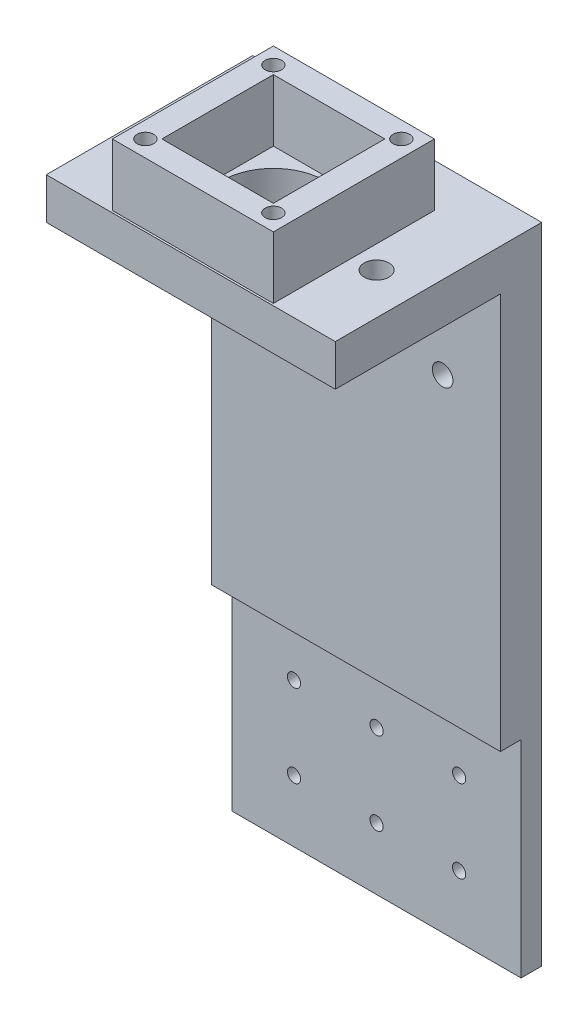
ISO-10303-21;
HEADER;
FILE_DESCRIPTION(('STEP AP214'),'2;1');
FILE_NAME('part.step','',(''),(''),'','','');
FILE_SCHEMA(('AUTOMOTIVE_DESIGN { 1 0 10303 214 1 1 1 1 }'));
ENDSEC;
DATA;
#1=APPLICATION_CONTEXT('core data for automotive mechanical design processes');
#2=APPLICATION_PROTOCOL_DEFINITION('international standard','automotive_design',2000,#1);
#3=PRODUCT_CONTEXT('',#1,'mechanical');
#4=PRODUCT('Part','Part','',(#3));
#5=PRODUCT_RELATED_PRODUCT_CATEGORY('part','',(#4));
#6=PRODUCT_DEFINITION_FORMATION('','',#4);
#7=PRODUCT_DEFINITION_CONTEXT('part definition',#1,'design');
#8=PRODUCT_DEFINITION('design','',#6,#7);
#9=PRODUCT_DEFINITION_SHAPE('','',#8);
#10=(LENGTH_UNIT() NAMED_UNIT(*) SI_UNIT(.MILLI.,.METRE.));
#11=(NAMED_UNIT(*) PLANE_ANGLE_UNIT() SI_UNIT($,.RADIAN.));
#12=(NAMED_UNIT(*) SI_UNIT($,.STERADIAN.) SOLID_ANGLE_UNIT());
#13=UNCERTAINTY_MEASURE_WITH_UNIT(LENGTH_MEASURE(1.E-05),#10,'distance_accuracy_value','');
#14=(GEOMETRIC_REPRESENTATION_CONTEXT(3) GLOBAL_UNCERTAINTY_ASSIGNED_CONTEXT((#13)) GLOBAL_UNIT_ASSIGNED_CONTEXT((#10,
#11,#12)) REPRESENTATION_CONTEXT('',''));
#15=CARTESIAN_POINT('',(0.,0.,0.));
#16=DIRECTION('',(0.,0.,1.));
#17=DIRECTION('',(1.,0.,0.));
#18=AXIS2_PLACEMENT_3D('',#15,#16,#17);
#19=CARTESIAN_POINT('',(37.8741031645975,90.,27.7151189199662));
#20=DIRECTION('',(0.,0.,1.));
#21=DIRECTION('',(1.,0.,0.));
#22=AXIS2_PLACEMENT_3D('',#19,#20,#21);
#23=PLANE('',#22);
#24=DIRECTION('',(-1.,0.,0.));
#25=VECTOR('',#24,1.);
#26=CARTESIAN_POINT('',(37.8741031645975,90.,27.7151189199662));
#27=LINE('',#26,#25);
#28=CARTESIAN_POINT('',(37.8641031645975,90.,27.7151189199662));
#29=VERTEX_POINT('',#28);
#30=CARTESIAN_POINT('',(-32.1358968354025,90.,27.7151189199662));
#31=VERTEX_POINT('',#30);
#32=EDGE_CURVE('E48',#29,#31,#27,.T.);
#33=ORIENTED_EDGE('',*,*,#32,.F.);
#34=DIRECTION('',(0.,1.,0.));
#35=VECTOR('',#34,1.);
#36=CARTESIAN_POINT('',(37.8641031645975,236.,27.7151189199662));
#37=LINE('',#36,#35);
#38=CARTESIAN_POINT('',(37.8641031645975,140.,27.7151189199662));
#39=VERTEX_POINT('',#38);
#40=EDGE_CURVE('E377',#29,#39,#37,.T.);
#41=ORIENTED_EDGE('',*,*,#40,.T.);
#42=DIRECTION('',(-1.,0.,0.));
#43=VECTOR('',#42,1.);
#44=CARTESIAN_POINT('',(37.8741031645975,140.,27.7151189199662));
#45=LINE('',#44,#43);
#46=CARTESIAN_POINT('',(-32.1358968354025,140.,27.7151189199662));
#47=VERTEX_POINT('',#46);
#48=EDGE_CURVE('E11',#39,#47,#45,.T.);
#49=ORIENTED_EDGE('',*,*,#48,.T.);
#50=DIRECTION('',(0.,-1.,0.));
#51=VECTOR('',#50,1.);
#52=CARTESIAN_POINT('',(-32.1358968354025,236.,27.7151189199662));
#53=LINE('',#52,#51);
#54=EDGE_CURVE('E184',#47,#31,#53,.T.);
#55=ORIENTED_EDGE('',*,*,#54,.T.);
#56=EDGE_LOOP('',(#33,#41,#49,#55));
#57=FACE_BOUND('',#56,.T.);
#58=CARTESIAN_POINT('',(-17.1358968354025,105.,27.7151189199662));
#59=DIRECTION('',(0.,0.,1.));
#60=DIRECTION('',(1.,0.,0.));
#61=AXIS2_PLACEMENT_3D('',#58,#59,#60);
#62=CIRCLE('',#61,1.60000000000001);
#63=CARTESIAN_POINT('',(-15.5358968354025,105.,27.7151189199662));
#64=VERTEX_POINT('',#63);
#65=EDGE_CURVE('E192',#64,#64,#62,.F.);
#66=ORIENTED_EDGE('',*,*,#65,.T.);
#67=EDGE_LOOP('',(#66));
#68=FACE_BOUND('',#67,.T.);
#69=CARTESIAN_POINT('',(2.86410316459753,125.,27.7151189199662));
#70=DIRECTION('',(0.,0.,1.));
#71=DIRECTION('',(1.,0.,0.));
#72=AXIS2_PLACEMENT_3D('',#69,#70,#71);
#73=CIRCLE('',#72,1.60000000000001);
#74=CARTESIAN_POINT('',(4.46410316459754,125.,27.7151189199662));
#75=VERTEX_POINT('',#74);
#76=EDGE_CURVE('E198',#75,#75,#73,.F.);
#77=ORIENTED_EDGE('',*,*,#76,.T.);
#78=EDGE_LOOP('',(#77));
#79=FACE_BOUND('',#78,.T.);
#80=CARTESIAN_POINT('',(22.8641031645975,105.,27.7151189199662));
#81=DIRECTION('',(0.,0.,1.));
#82=DIRECTION('',(1.,0.,0.));
#83=AXIS2_PLACEMENT_3D('',#80,#81,#82);
#84=CIRCLE('',#83,1.60000000000001);
#85=CARTESIAN_POINT('',(24.4641031645975,105.,27.7151189199662));
#86=VERTEX_POINT('',#85);
#87=EDGE_CURVE('E204',#86,#86,#84,.F.);
#88=ORIENTED_EDGE('',*,*,#87,.T.);
#89=EDGE_LOOP('',(#88));
#90=FACE_BOUND('',#89,.T.);
#91=CARTESIAN_POINT('',(2.86410316459753,105.,27.7151189199662));
#92=DIRECTION('',(0.,0.,1.));
#93=DIRECTION('',(1.,0.,0.));
#94=AXIS2_PLACEMENT_3D('',#91,#92,#93);
#95=CIRCLE('',#94,1.60000000000001);
#96=CARTESIAN_POINT('',(4.46410316459754,105.,27.7151189199662));
#97=VERTEX_POINT('',#96);
#98=EDGE_CURVE('E207',#97,#97,#95,.F.);
#99=ORIENTED_EDGE('',*,*,#98,.T.);
#100=EDGE_LOOP('',(#99));
#101=FACE_BOUND('',#100,.T.);
#102=CARTESIAN_POINT('',(-17.1358968354025,125.,27.7151189199662));
#103=DIRECTION('',(0.,0.,1.));
#104=DIRECTION('',(1.,0.,0.));
#105=AXIS2_PLACEMENT_3D('',#102,#103,#104);
#106=CIRCLE('',#105,1.60000000000001);
#107=CARTESIAN_POINT('',(-15.5358968354025,125.,27.7151189199662));
#108=VERTEX_POINT('',#107);
#109=EDGE_CURVE('E201',#108,#108,#106,.F.);
#110=ORIENTED_EDGE('',*,*,#109,.T.);
#111=EDGE_LOOP('',(#110));
#112=FACE_BOUND('',#111,.T.);
#113=CARTESIAN_POINT('',(22.8641031645975,125.,27.7151189199662));
#114=DIRECTION('',(0.,0.,1.));
#115=DIRECTION('',(1.,0.,0.));
#116=AXIS2_PLACEMENT_3D('',#113,#114,#115);
#117=CIRCLE('',#116,1.60000000000001);
#118=CARTESIAN_POINT('',(24.4641031645975,125.,27.7151189199662));
#119=VERTEX_POINT('',#118);
#120=EDGE_CURVE('E195',#119,#119,#117,.F.);
#121=ORIENTED_EDGE('',*,*,#120,.T.);
#122=EDGE_LOOP('',(#121));
#123=FACE_BOUND('',#122,.T.);
#124=ADVANCED_FACE('F38',(#57,#68,#79,#90,#101,#112,#123),#23,.T.);
#125=CARTESIAN_POINT('',(37.8741031645975,90.,22.7151189199662));
#126=DIRECTION('',(0.,-1.,0.));
#127=DIRECTION('',(0.,0.,-1.));
#128=AXIS2_PLACEMENT_3D('',#125,#126,#127);
#129=PLANE('',#128);
#130=DIRECTION('',(1.,0.,0.));
#131=VECTOR('',#130,1.);
#132=CARTESIAN_POINT('',(37.8641031645975,90.,22.7151189199662));
#133=LINE('',#132,#131);
#134=CARTESIAN_POINT('',(-32.1358968354025,90.,22.7151189199662));
#135=VERTEX_POINT('',#134);
#136=CARTESIAN_POINT('',(37.8641031645975,90.,22.7151189199662));
#137=VERTEX_POINT('',#136);
#138=EDGE_CURVE('E175',#135,#137,#133,.T.);
#139=ORIENTED_EDGE('',*,*,#138,.T.);
#140=DIRECTION('',(0.,0.,1.));
#141=VECTOR('',#140,1.);
#142=CARTESIAN_POINT('',(37.8641031645975,90.,32.7151189199658));
#143=LINE('',#142,#141);
#144=EDGE_CURVE('E375',#137,#29,#143,.T.);
#145=ORIENTED_EDGE('',*,*,#144,.T.);
#146=ORIENTED_EDGE('',*,*,#32,.T.);
#147=DIRECTION('',(0.,0.,-1.));
#148=VECTOR('',#147,1.);
#149=CARTESIAN_POINT('',(-32.1358968354025,90.,22.7151189199658));
#150=LINE('',#149,#148);
#151=EDGE_CURVE('E165',#31,#135,#150,.T.);
#152=ORIENTED_EDGE('',*,*,#151,.T.);
#153=EDGE_LOOP('',(#139,#145,#146,#152));
#154=FACE_BOUND('',#153,.T.);
#155=ADVANCED_FACE('F182',(#154),#129,.T.);
#156=CARTESIAN_POINT('',(37.8741031645975,140.,27.7151189199662));
#157=DIRECTION('',(0.,-1.,0.));
#158=DIRECTION('',(0.,0.,-1.));
#159=AXIS2_PLACEMENT_3D('',#156,#157,#158);
#160=PLANE('',#159);
#161=ORIENTED_EDGE('',*,*,#48,.F.);
#162=DIRECTION('',(0.,0.,1.));
#163=VECTOR('',#162,1.);
#164=CARTESIAN_POINT('',(37.8641031645975,140.,32.7151189199662));
#165=LINE('',#164,#163);
#166=CARTESIAN_POINT('',(37.8641031645975,140.,32.7151189199662));
#167=VERTEX_POINT('',#166);
#168=EDGE_CURVE('E180',#39,#167,#165,.T.);
#169=ORIENTED_EDGE('',*,*,#168,.T.);
#170=DIRECTION('',(-1.,0.,0.));
#171=VECTOR('',#170,1.);
#172=CARTESIAN_POINT('',(-32.1358968354025,140.,32.7151189199662));
#173=LINE('',#172,#171);
#174=CARTESIAN_POINT('',(-32.1358968354025,140.,32.7151189199662));
#175=VERTEX_POINT('',#174);
#176=EDGE_CURVE('E210',#167,#175,#173,.T.);
#177=ORIENTED_EDGE('',*,*,#176,.T.);
#178=DIRECTION('',(0.,0.,-1.));
#179=VECTOR('',#178,1.);
#180=CARTESIAN_POINT('',(-32.1358968354025,140.,22.7151189199662));
#181=LINE('',#180,#179);
#182=EDGE_CURVE('E186',#175,#47,#181,.T.);
#183=ORIENTED_EDGE('',*,*,#182,.T.);
#184=EDGE_LOOP('',(#161,#169,#177,#183));
#185=FACE_BOUND('',#184,.T.);
#186=ADVANCED_FACE('F381',(#185),#160,.T.);
#187=CARTESIAN_POINT('',(-32.1358968354025,236.,32.7151189199662));
#188=DIRECTION('',(0.,0.,-1.));
#189=DIRECTION('',(-1.,0.,0.));
#190=AXIS2_PLACEMENT_3D('',#187,#188,#189);
#191=PLANE('',#190);
#192=CARTESIAN_POINT('',(-18.1358968354025,212.,32.7151189199662));
#193=DIRECTION('',(0.,0.,1.));
#194=DIRECTION('',(1.,0.,0.));
#195=AXIS2_PLACEMENT_3D('',#192,#193,#194);
#196=CIRCLE('',#195,2.5);
#197=CARTESIAN_POINT('',(-15.6358968354025,212.,32.7151189199662));
#198=VERTEX_POINT('',#197);
#199=EDGE_CURVE('E225',#198,#198,#196,.T.);
#200=ORIENTED_EDGE('',*,*,#199,.F.);
#201=EDGE_LOOP('',(#200));
#202=FACE_BOUND('',#201,.T.);
#203=CARTESIAN_POINT('',(23.8641031645975,212.,32.7151189199662));
#204=DIRECTION('',(0.,0.,1.));
#205=DIRECTION('',(-1.,0.,0.));
#206=AXIS2_PLACEMENT_3D('',#203,#204,#205);
#207=CIRCLE('',#206,2.5);
#208=CARTESIAN_POINT('',(21.3641031645975,212.,32.7151189199662));
#209=VERTEX_POINT('',#208);
#210=EDGE_CURVE('E232',#209,#209,#207,.T.);
#211=ORIENTED_EDGE('',*,*,#210,.F.);
#212=EDGE_LOOP('',(#211));
#213=FACE_BOUND('',#212,.T.);
#214=ORIENTED_EDGE('',*,*,#176,.F.);
#215=DIRECTION('',(0.,-1.,0.));
#216=VECTOR('',#215,1.);
#217=CARTESIAN_POINT('',(37.8641031645975,236.,32.7151189199662));
#218=LINE('',#217,#216);
#219=CARTESIAN_POINT('',(37.8641031645975,236.,32.7151189199662));
#220=VERTEX_POINT('',#219);
#221=EDGE_CURVE('E42',#220,#167,#218,.T.);
#222=ORIENTED_EDGE('',*,*,#221,.F.);
#223=DIRECTION('',(1.,0.,0.));
#224=VECTOR('',#223,1.);
#225=CARTESIAN_POINT('',(-32.1358968354025,236.,32.7151189199662));
#226=LINE('',#225,#224);
#227=CARTESIAN_POINT('',(-32.1358968354025,236.,32.7151189199662));
#228=VERTEX_POINT('',#227);
#229=EDGE_CURVE('E215',#228,#220,#226,.T.);
#230=ORIENTED_EDGE('',*,*,#229,.F.);
#231=DIRECTION('',(0.,-1.,0.));
#232=VECTOR('',#231,1.);
#233=CARTESIAN_POINT('',(-32.1358968354025,236.,32.7151189199662));
#234=LINE('',#233,#232);
#235=EDGE_CURVE('E171',#228,#175,#234,.T.);
#236=ORIENTED_EDGE('',*,*,#235,.T.);
#237=EDGE_LOOP('',(#214,#222,#230,#236));
#238=FACE_BOUND('',#237,.T.);
#239=ADVANCED_FACE('F388',(#202,#213,#238),#191,.F.);
#240=CARTESIAN_POINT('',(37.8641031645975,236.,32.7151189199662));
#241=DIRECTION('',(-1.,0.,0.));
#242=DIRECTION('',(0.,0.,1.));
#243=AXIS2_PLACEMENT_3D('',#240,#241,#242);
#244=PLANE('',#243);
#245=ORIENTED_EDGE('',*,*,#144,.F.);
#246=DIRECTION('',(0.,-1.,0.));
#247=VECTOR('',#246,1.);
#248=CARTESIAN_POINT('',(37.8641031645975,236.,22.7151189199662));
#249=LINE('',#248,#247);
#250=CARTESIAN_POINT('',(37.8641031645975,246.,22.7151189199662));
#251=VERTEX_POINT('',#250);
#252=EDGE_CURVE('E172',#251,#137,#249,.T.);
#253=ORIENTED_EDGE('',*,*,#252,.F.);
#254=DIRECTION('',(0.,0.,-1.));
#255=VECTOR('',#254,1.);
#256=CARTESIAN_POINT('',(37.8641031645975,246.,72.7151189199662));
#257=LINE('',#256,#255);
#258=CARTESIAN_POINT('',(37.8641031645975,246.,72.7151189199662));
#259=VERTEX_POINT('',#258);
#260=EDGE_CURVE('E241',#259,#251,#257,.T.);
#261=ORIENTED_EDGE('',*,*,#260,.F.);
#262=DIRECTION('',(0.,-1.,0.));
#263=VECTOR('',#262,1.);
#264=CARTESIAN_POINT('',(37.8641031645975,236.,72.7151189199662));
#265=LINE('',#264,#263);
#266=CARTESIAN_POINT('',(37.8641031645975,236.,72.7151189199662));
#267=VERTEX_POINT('',#266);
#268=EDGE_CURVE('E239',#259,#267,#265,.T.);
#269=ORIENTED_EDGE('',*,*,#268,.T.);
#270=DIRECTION('',(0.,0.,-1.));
#271=VECTOR('',#270,1.);
#272=CARTESIAN_POINT('',(37.8641031645975,236.,72.7151189199662));
#273=LINE('',#272,#271);
#274=EDGE_CURVE('E231',#267,#220,#273,.T.);
#275=ORIENTED_EDGE('',*,*,#274,.T.);
#276=ORIENTED_EDGE('',*,*,#221,.T.);
#277=ORIENTED_EDGE('',*,*,#168,.F.);
#278=ORIENTED_EDGE('',*,*,#40,.F.);
#279=EDGE_LOOP('',(#245,#253,#261,#269,#275,#276,#277,#278));
#280=FACE_BOUND('',#279,.T.);
#281=ADVANCED_FACE('F384',(#280),#244,.F.);
#282=CARTESIAN_POINT('',(37.8641031645975,236.,22.7151189199662));
#283=DIRECTION('',(0.,0.,1.));
#284=DIRECTION('',(1.,0.,0.));
#285=AXIS2_PLACEMENT_3D('',#282,#283,#284);
#286=PLANE('',#285);
#287=CARTESIAN_POINT('',(23.8641031645975,212.,22.7151189199662));
#288=DIRECTION('',(0.,0.,1.));
#289=DIRECTION('',(-1.,0.,0.));
#290=AXIS2_PLACEMENT_3D('',#287,#288,#289);
#291=CIRCLE('',#290,2.5);
#292=CARTESIAN_POINT('',(21.3641031645975,212.,22.7151189199662));
#293=VERTEX_POINT('',#292);
#294=EDGE_CURVE('E228',#293,#293,#291,.T.);
#295=ORIENTED_EDGE('',*,*,#294,.T.);
#296=EDGE_LOOP('',(#295));
#297=FACE_BOUND('',#296,.T.);
#298=CARTESIAN_POINT('',(-18.1358968354025,212.,22.7151189199662));
#299=DIRECTION('',(0.,0.,1.));
#300=DIRECTION('',(1.,0.,0.));
#301=AXIS2_PLACEMENT_3D('',#298,#299,#300);
#302=CIRCLE('',#301,2.5);
#303=CARTESIAN_POINT('',(-15.6358968354025,212.,22.7151189199662));
#304=VERTEX_POINT('',#303);
#305=EDGE_CURVE('E220',#304,#304,#302,.T.);
#306=ORIENTED_EDGE('',*,*,#305,.T.);
#307=EDGE_LOOP('',(#306));
#308=FACE_BOUND('',#307,.T.);
#309=CARTESIAN_POINT('',(-17.1358968354025,105.,22.7151189199662));
#310=DIRECTION('',(0.,0.,-1.));
#311=DIRECTION('',(-1.,0.,0.));
#312=AXIS2_PLACEMENT_3D('',#309,#310,#311);
#313=CIRCLE('',#312,1.60000000000001);
#314=CARTESIAN_POINT('',(-18.7358968354025,105.,22.7151189199662));
#315=VERTEX_POINT('',#314);
#316=EDGE_CURVE('E355',#315,#315,#313,.T.);
#317=ORIENTED_EDGE('',*,*,#316,.F.);
#318=EDGE_LOOP('',(#317));
#319=FACE_BOUND('',#318,.T.);
#320=CARTESIAN_POINT('',(22.8641031645975,125.,22.7151189199662));
#321=DIRECTION('',(0.,0.,-1.));
#322=DIRECTION('',(1.,0.,0.));
#323=AXIS2_PLACEMENT_3D('',#320,#321,#322);
#324=CIRCLE('',#323,1.60000000000001);
#325=CARTESIAN_POINT('',(24.4641031645975,125.,22.7151189199662));
#326=VERTEX_POINT('',#325);
#327=EDGE_CURVE('E362',#326,#326,#324,.T.);
#328=ORIENTED_EDGE('',*,*,#327,.F.);
#329=EDGE_LOOP('',(#328));
#330=FACE_BOUND('',#329,.T.);
#331=CARTESIAN_POINT('',(2.86410316459753,125.,22.7151189199662));
#332=DIRECTION('',(0.,0.,-1.));
#333=DIRECTION('',(1.,0.,0.));
#334=AXIS2_PLACEMENT_3D('',#331,#332,#333);
#335=CIRCLE('',#334,1.60000000000001);
#336=CARTESIAN_POINT('',(4.46410316459754,125.,22.7151189199662));
#337=VERTEX_POINT('',#336);
#338=EDGE_CURVE('E359',#337,#337,#335,.T.);
#339=ORIENTED_EDGE('',*,*,#338,.F.);
#340=EDGE_LOOP('',(#339));
#341=FACE_BOUND('',#340,.T.);
#342=CARTESIAN_POINT('',(-17.1358968354025,125.,22.7151189199662));
#343=DIRECTION('',(0.,0.,-1.));
#344=DIRECTION('',(1.,0.,0.));
#345=AXIS2_PLACEMENT_3D('',#342,#343,#344);
#346=CIRCLE('',#345,1.60000000000001);
#347=CARTESIAN_POINT('',(-15.5358968354025,125.,22.7151189199662));
#348=VERTEX_POINT('',#347);
#349=EDGE_CURVE('E363',#348,#348,#346,.T.);
#350=ORIENTED_EDGE('',*,*,#349,.F.);
#351=EDGE_LOOP('',(#350));
#352=FACE_BOUND('',#351,.T.);
#353=CARTESIAN_POINT('',(22.8641031645975,105.,22.7151189199662));
#354=DIRECTION('',(0.,0.,-1.));
#355=DIRECTION('',(-1.,0.,0.));
#356=AXIS2_PLACEMENT_3D('',#353,#354,#355);
#357=CIRCLE('',#356,1.60000000000001);
#358=CARTESIAN_POINT('',(21.2641031645975,105.,22.7151189199662));
#359=VERTEX_POINT('',#358);
#360=EDGE_CURVE('E366',#359,#359,#357,.T.);
#361=ORIENTED_EDGE('',*,*,#360,.F.);
#362=EDGE_LOOP('',(#361));
#363=FACE_BOUND('',#362,.T.);
#364=CARTESIAN_POINT('',(2.86410316459753,105.,22.7151189199662));
#365=DIRECTION('',(0.,0.,-1.));
#366=DIRECTION('',(-1.,0.,0.));
#367=AXIS2_PLACEMENT_3D('',#364,#365,#366);
#368=CIRCLE('',#367,1.60000000000001);
#369=CARTESIAN_POINT('',(1.26410316459752,105.,22.7151189199662));
#370=VERTEX_POINT('',#369);
#371=EDGE_CURVE('E358',#370,#370,#368,.T.);
#372=ORIENTED_EDGE('',*,*,#371,.F.);
#373=EDGE_LOOP('',(#372));
#374=FACE_BOUND('',#373,.T.);
#375=ORIENTED_EDGE('',*,*,#138,.F.);
#376=DIRECTION('',(0.,-1.,0.));
#377=VECTOR('',#376,1.);
#378=CARTESIAN_POINT('',(-32.1358968354025,236.,22.7151189199662));
#379=LINE('',#378,#377);
#380=CARTESIAN_POINT('',(-32.1358968354025,246.,22.7151189199662));
#381=VERTEX_POINT('',#380);
#382=EDGE_CURVE('E161',#381,#135,#379,.T.);
#383=ORIENTED_EDGE('',*,*,#382,.F.);
#384=DIRECTION('',(1.,0.,0.));
#385=VECTOR('',#384,1.);
#386=CARTESIAN_POINT('',(37.8641031645975,246.,22.7151189199662));
#387=LINE('',#386,#385);
#388=EDGE_CURVE('E245',#381,#251,#387,.T.);
#389=ORIENTED_EDGE('',*,*,#388,.T.);
#390=ORIENTED_EDGE('',*,*,#252,.T.);
#391=EDGE_LOOP('',(#375,#383,#389,#390));
#392=FACE_BOUND('',#391,.T.);
#393=ADVANCED_FACE('F176',(#297,#308,#319,#330,#341,#352,#363,#374,#392),#286,.F.);
#394=CARTESIAN_POINT('',(-32.1358968354025,236.,22.7151189199662));
#395=DIRECTION('',(1.,0.,0.));
#396=DIRECTION('',(0.,0.,-1.));
#397=AXIS2_PLACEMENT_3D('',#394,#395,#396);
#398=PLANE('',#397);
#399=ORIENTED_EDGE('',*,*,#151,.F.);
#400=ORIENTED_EDGE('',*,*,#54,.F.);
#401=ORIENTED_EDGE('',*,*,#182,.F.);
#402=ORIENTED_EDGE('',*,*,#235,.F.);
#403=DIRECTION('',(0.,0.,-1.));
#404=VECTOR('',#403,1.);
#405=CARTESIAN_POINT('',(-32.1358968354025,236.,72.7151189199662));
#406=LINE('',#405,#404);
#407=CARTESIAN_POINT('',(-32.1358968354025,236.,72.7151189199662));
#408=VERTEX_POINT('',#407);
#409=EDGE_CURVE('E237',#408,#228,#406,.T.);
#410=ORIENTED_EDGE('',*,*,#409,.F.);
#411=DIRECTION('',(0.,1.,0.));
#412=VECTOR('',#411,1.);
#413=CARTESIAN_POINT('',(-32.1358968354025,246.,72.7151189199662));
#414=LINE('',#413,#412);
#415=CARTESIAN_POINT('',(-32.1358968354025,246.,72.7151189199662));
#416=VERTEX_POINT('',#415);
#417=EDGE_CURVE('E254',#408,#416,#414,.T.);
#418=ORIENTED_EDGE('',*,*,#417,.T.);
#419=DIRECTION('',(0.,0.,-1.));
#420=VECTOR('',#419,1.);
#421=CARTESIAN_POINT('',(-32.1358968354025,246.,72.7151189199662));
#422=LINE('',#421,#420);
#423=EDGE_CURVE('E167',#416,#381,#422,.T.);
#424=ORIENTED_EDGE('',*,*,#423,.T.);
#425=ORIENTED_EDGE('',*,*,#382,.T.);
#426=EDGE_LOOP('',(#399,#400,#401,#402,#410,#418,#424,#425));
#427=FACE_BOUND('',#426,.T.);
#428=ADVANCED_FACE('F40',(#427),#398,.F.);
#429=CARTESIAN_POINT('',(-17.1358968354025,105.,32.7151189199662));
#430=DIRECTION('',(0.,0.,-1.));
#431=DIRECTION('',(-1.,0.,0.));
#432=AXIS2_PLACEMENT_3D('',#429,#430,#431);
#433=CYLINDRICAL_SURFACE('',#432,1.60000000000001);
#434=ORIENTED_EDGE('',*,*,#316,.T.);
#435=EDGE_LOOP('',(#434));
#436=FACE_BOUND('',#435,.T.);
#437=ORIENTED_EDGE('',*,*,#65,.F.);
#438=EDGE_LOOP('',(#437));
#439=FACE_BOUND('',#438,.T.);
#440=ADVANCED_FACE('F448',(#436,#439),#433,.F.);
#441=CARTESIAN_POINT('',(22.8641031645975,125.,32.7151189199662));
#442=DIRECTION('',(0.,0.,-1.));
#443=DIRECTION('',(-1.,0.,0.));
#444=AXIS2_PLACEMENT_3D('',#441,#442,#443);
#445=CYLINDRICAL_SURFACE('',#444,1.60000000000001);
#446=ORIENTED_EDGE('',*,*,#327,.T.);
#447=EDGE_LOOP('',(#446));
#448=FACE_BOUND('',#447,.T.);
#449=ORIENTED_EDGE('',*,*,#120,.F.);
#450=EDGE_LOOP('',(#449));
#451=FACE_BOUND('',#450,.T.);
#452=ADVANCED_FACE('F444',(#448,#451),#445,.F.);
#453=CARTESIAN_POINT('',(2.86410316459753,125.,32.7151189199662));
#454=DIRECTION('',(0.,0.,-1.));
#455=DIRECTION('',(-1.,0.,0.));
#456=AXIS2_PLACEMENT_3D('',#453,#454,#455);
#457=CYLINDRICAL_SURFACE('',#456,1.60000000000001);
#458=ORIENTED_EDGE('',*,*,#338,.T.);
#459=EDGE_LOOP('',(#458));
#460=FACE_BOUND('',#459,.T.);
#461=ORIENTED_EDGE('',*,*,#76,.F.);
#462=EDGE_LOOP('',(#461));
#463=FACE_BOUND('',#462,.T.);
#464=ADVANCED_FACE('F440',(#460,#463),#457,.F.);
#465=CARTESIAN_POINT('',(-17.1358968354025,125.,32.7151189199662));
#466=DIRECTION('',(0.,0.,-1.));
#467=DIRECTION('',(-1.,0.,0.));
#468=AXIS2_PLACEMENT_3D('',#465,#466,#467);
#469=CYLINDRICAL_SURFACE('',#468,1.60000000000001);
#470=ORIENTED_EDGE('',*,*,#349,.T.);
#471=EDGE_LOOP('',(#470));
#472=FACE_BOUND('',#471,.T.);
#473=ORIENTED_EDGE('',*,*,#109,.F.);
#474=EDGE_LOOP('',(#473));
#475=FACE_BOUND('',#474,.T.);
#476=ADVANCED_FACE('F436',(#472,#475),#469,.F.);
#477=CARTESIAN_POINT('',(22.8641031645975,105.,32.7151189199662));
#478=DIRECTION('',(0.,0.,-1.));
#479=DIRECTION('',(-1.,0.,0.));
#480=AXIS2_PLACEMENT_3D('',#477,#478,#479);
#481=CYLINDRICAL_SURFACE('',#480,1.60000000000001);
#482=ORIENTED_EDGE('',*,*,#360,.T.);
#483=EDGE_LOOP('',(#482));
#484=FACE_BOUND('',#483,.T.);
#485=ORIENTED_EDGE('',*,*,#87,.F.);
#486=EDGE_LOOP('',(#485));
#487=FACE_BOUND('',#486,.T.);
#488=ADVANCED_FACE('F432',(#484,#487),#481,.F.);
#489=CARTESIAN_POINT('',(2.86410316459753,105.,32.7151189199662));
#490=DIRECTION('',(0.,0.,-1.));
#491=DIRECTION('',(-1.,0.,0.));
#492=AXIS2_PLACEMENT_3D('',#489,#490,#491);
#493=CYLINDRICAL_SURFACE('',#492,1.60000000000001);
#494=ORIENTED_EDGE('',*,*,#371,.T.);
#495=EDGE_LOOP('',(#494));
#496=FACE_BOUND('',#495,.T.);
#497=ORIENTED_EDGE('',*,*,#98,.F.);
#498=EDGE_LOOP('',(#497));
#499=FACE_BOUND('',#498,.T.);
#500=ADVANCED_FACE('F414',(#496,#499),#493,.F.);
#501=CARTESIAN_POINT('',(37.8641031645975,246.,72.7151189199662));
#502=DIRECTION('',(0.,1.,0.));
#503=DIRECTION('',(0.,0.,1.));
#504=AXIS2_PLACEMENT_3D('',#501,#502,#503);
#505=PLANE('',#504);
#506=CARTESIAN_POINT('',(2.86410316459754,246.,52.7151189199662));
#507=DIRECTION('',(0.,-1.,0.));
#508=DIRECTION('',(0.,0.,-1.));
#509=AXIS2_PLACEMENT_3D('',#506,#507,#508);
#510=CIRCLE('',#509,12.5);
#511=CARTESIAN_POINT('',(2.86410316459754,246.,40.2151189199662));
#512=VERTEX_POINT('',#511);
#513=EDGE_CURVE('E247',#512,#512,#510,.T.);
#514=ORIENTED_EDGE('',*,*,#513,.T.);
#515=EDGE_LOOP('',(#514));
#516=FACE_BOUND('',#515,.T.);
#517=DIRECTION('',(-1.,0.,0.));
#518=VECTOR('',#517,1.);
#519=CARTESIAN_POINT('',(-16.6358968354025,246.,39.2151189199662));
#520=LINE('',#519,#518);
#521=CARTESIAN_POINT('',(16.3641031645975,246.,39.2151189199662));
#522=VERTEX_POINT('',#521);
#523=CARTESIAN_POINT('',(-10.6358968354025,246.,39.2151189199662));
#524=VERTEX_POINT('',#523);
#525=EDGE_CURVE('E304',#522,#524,#520,.T.);
#526=ORIENTED_EDGE('',*,*,#525,.T.);
#527=DIRECTION('',(0.,0.,1.));
#528=VECTOR('',#527,1.);
#529=CARTESIAN_POINT('',(-10.6358968354025,246.,33.2151189199662));
#530=LINE('',#529,#528);
#531=CARTESIAN_POINT('',(-10.6358968354025,246.,66.2151189199662));
#532=VERTEX_POINT('',#531);
#533=EDGE_CURVE('E311',#524,#532,#530,.T.);
#534=ORIENTED_EDGE('',*,*,#533,.T.);
#535=DIRECTION('',(1.,0.,0.));
#536=VECTOR('',#535,1.);
#537=CARTESIAN_POINT('',(-16.6358968354025,246.,66.2151189199662));
#538=LINE('',#537,#536);
#539=CARTESIAN_POINT('',(16.3641031645975,246.,66.2151189199662));
#540=VERTEX_POINT('',#539);
#541=EDGE_CURVE('E57',#532,#540,#538,.T.);
#542=ORIENTED_EDGE('',*,*,#541,.T.);
#543=DIRECTION('',(0.,0.,-1.));
#544=VECTOR('',#543,1.);
#545=CARTESIAN_POINT('',(16.3641031645975,246.,33.2151189199662));
#546=LINE('',#545,#544);
#547=EDGE_CURVE('E307',#540,#522,#546,.T.);
#548=ORIENTED_EDGE('',*,*,#547,.T.);
#549=EDGE_LOOP('',(#526,#534,#542,#548));
#550=FACE_BOUND('',#549,.T.);
#551=ADVANCED_FACE('F400',(#516,#550),#505,.T.);
#552=CARTESIAN_POINT('',(23.8641031645975,212.,22.7151189199662));
#553=DIRECTION('',(0.,0.,1.));
#554=DIRECTION('',(1.,0.,0.));
#555=AXIS2_PLACEMENT_3D('',#552,#553,#554);
#556=CYLINDRICAL_SURFACE('',#555,2.5);
#557=ORIENTED_EDGE('',*,*,#294,.F.);
#558=EDGE_LOOP('',(#557));
#559=FACE_BOUND('',#558,.T.);
#560=ORIENTED_EDGE('',*,*,#210,.T.);
#561=EDGE_LOOP('',(#560));
#562=FACE_BOUND('',#561,.T.);
#563=ADVANCED_FACE('F413',(#559,#562),#556,.F.);
#564=CARTESIAN_POINT('',(-18.1358968354025,212.,22.7151189199662));
#565=DIRECTION('',(0.,0.,1.));
#566=DIRECTION('',(1.,0.,0.));
#567=AXIS2_PLACEMENT_3D('',#564,#565,#566);
#568=CYLINDRICAL_SURFACE('',#567,2.5);
#569=ORIENTED_EDGE('',*,*,#305,.F.);
#570=EDGE_LOOP('',(#569));
#571=FACE_BOUND('',#570,.T.);
#572=ORIENTED_EDGE('',*,*,#199,.T.);
#573=EDGE_LOOP('',(#572));
#574=FACE_BOUND('',#573,.T.);
#575=ADVANCED_FACE('F407',(#571,#574),#568,.F.);
#576=CARTESIAN_POINT('',(-32.1358968354025,236.,72.7151189199662));
#577=DIRECTION('',(0.,-1.,0.));
#578=DIRECTION('',(0.,0.,-1.));
#579=AXIS2_PLACEMENT_3D('',#576,#577,#578);
#580=PLANE('',#579);
#581=CARTESIAN_POINT('',(-22.1358968354025,236.,52.7151189199662));
#582=DIRECTION('',(0.,-1.,0.));
#583=DIRECTION('',(0.,0.,-1.));
#584=AXIS2_PLACEMENT_3D('',#581,#582,#583);
#585=CIRCLE('',#584,3.);
#586=CARTESIAN_POINT('',(-22.1358968354025,236.,49.7151189199662));
#587=VERTEX_POINT('',#586);
#588=EDGE_CURVE('E341',#587,#587,#585,.T.);
#589=ORIENTED_EDGE('',*,*,#588,.F.);
#590=EDGE_LOOP('',(#589));
#591=FACE_BOUND('',#590,.T.);
#592=CARTESIAN_POINT('',(27.8641031645975,236.,52.7151189199662));
#593=DIRECTION('',(0.,-1.,0.));
#594=DIRECTION('',(0.,0.,-1.));
#595=AXIS2_PLACEMENT_3D('',#592,#593,#594);
#596=CIRCLE('',#595,3.);
#597=CARTESIAN_POINT('',(27.8641031645975,236.,49.7151189199662));
#598=VERTEX_POINT('',#597);
#599=EDGE_CURVE('E349',#598,#598,#596,.T.);
#600=ORIENTED_EDGE('',*,*,#599,.F.);
#601=EDGE_LOOP('',(#600));
#602=FACE_BOUND('',#601,.T.);
#603=CARTESIAN_POINT('',(18.3641031645975,236.,37.2151189199662));
#604=DIRECTION('',(0.,1.,0.));
#605=DIRECTION('',(0.,0.,-1.));
#606=AXIS2_PLACEMENT_3D('',#603,#604,#605);
#607=CIRCLE('',#606,2.);
#608=CARTESIAN_POINT('',(18.3641031645975,236.,35.2151189199662));
#609=VERTEX_POINT('',#608);
#610=EDGE_CURVE('E333',#609,#609,#607,.T.);
#611=ORIENTED_EDGE('',*,*,#610,.T.);
#612=EDGE_LOOP('',(#611));
#613=FACE_BOUND('',#612,.T.);
#614=CARTESIAN_POINT('',(-12.6358968354025,236.,68.2151189199662));
#615=DIRECTION('',(0.,1.,0.));
#616=DIRECTION('',(0.,0.,-1.));
#617=AXIS2_PLACEMENT_3D('',#614,#615,#616);
#618=CIRCLE('',#617,2.);
#619=CARTESIAN_POINT('',(-12.6358968354025,236.,66.2151189199662));
#620=VERTEX_POINT('',#619);
#621=EDGE_CURVE('E326',#620,#620,#618,.T.);
#622=ORIENTED_EDGE('',*,*,#621,.T.);
#623=EDGE_LOOP('',(#622));
#624=FACE_BOUND('',#623,.T.);
#625=CARTESIAN_POINT('',(18.3641031645975,236.,68.2151189199662));
#626=DIRECTION('',(0.,1.,0.));
#627=DIRECTION('',(0.,0.,1.));
#628=AXIS2_PLACEMENT_3D('',#625,#626,#627);
#629=CIRCLE('',#628,2.);
#630=CARTESIAN_POINT('',(18.3641031645975,236.,70.2151189199662));
#631=VERTEX_POINT('',#630);
#632=EDGE_CURVE('E338',#631,#631,#629,.T.);
#633=ORIENTED_EDGE('',*,*,#632,.T.);
#634=EDGE_LOOP('',(#633));
#635=FACE_BOUND('',#634,.T.);
#636=CARTESIAN_POINT('',(-12.6358968354025,236.,37.2151189199662));
#637=DIRECTION('',(0.,1.,0.));
#638=DIRECTION('',(0.,0.,1.));
#639=AXIS2_PLACEMENT_3D('',#636,#637,#638);
#640=CIRCLE('',#639,2.);
#641=CARTESIAN_POINT('',(-12.6358968354025,236.,39.2151189199662));
#642=VERTEX_POINT('',#641);
#643=EDGE_CURVE('E314',#642,#642,#640,.T.);
#644=ORIENTED_EDGE('',*,*,#643,.T.);
#645=EDGE_LOOP('',(#644));
#646=FACE_BOUND('',#645,.T.);
#647=CARTESIAN_POINT('',(2.86410316459754,236.,52.7151189199662));
#648=DIRECTION('',(0.,-1.,0.));
#649=DIRECTION('',(0.,0.,-1.));
#650=AXIS2_PLACEMENT_3D('',#647,#648,#649);
#651=CIRCLE('',#650,12.5);
#652=CARTESIAN_POINT('',(2.86410316459754,236.,40.2151189199662));
#653=VERTEX_POINT('',#652);
#654=EDGE_CURVE('E258',#653,#653,#651,.T.);
#655=ORIENTED_EDGE('',*,*,#654,.F.);
#656=EDGE_LOOP('',(#655));
#657=FACE_BOUND('',#656,.T.);
#658=ORIENTED_EDGE('',*,*,#409,.T.);
#659=ORIENTED_EDGE('',*,*,#229,.T.);
#660=ORIENTED_EDGE('',*,*,#274,.F.);
#661=DIRECTION('',(-1.,0.,0.));
#662=VECTOR('',#661,1.);
#663=CARTESIAN_POINT('',(-32.1358968354025,236.,72.7151189199662));
#664=LINE('',#663,#662);
#665=EDGE_CURVE('E248',#267,#408,#664,.T.);
#666=ORIENTED_EDGE('',*,*,#665,.T.);
#667=EDGE_LOOP('',(#658,#659,#660,#666));
#668=FACE_BOUND('',#667,.T.);
#669=ADVANCED_FACE('F389',(#591,#602,#613,#624,#635,#646,#657,#668),#580,.T.);
#670=CARTESIAN_POINT('',(-22.1358968354025,246.,52.7151189199662));
#671=DIRECTION('',(0.,1.,0.));
#672=DIRECTION('',(0.,0.,1.));
#673=AXIS2_PLACEMENT_3D('',#670,#671,#672);
#674=CIRCLE('',#673,3.);
#675=CARTESIAN_POINT('',(-22.1358968354025,246.,55.7151189199662));
#676=VERTEX_POINT('',#675);
#677=EDGE_CURVE('E346',#676,#676,#674,.T.);
#678=ORIENTED_EDGE('',*,*,#677,.F.);
#679=EDGE_LOOP('',(#678));
#680=FACE_BOUND('',#679,.T.);
#681=CARTESIAN_POINT('',(27.8641031645975,246.,52.7151189199662));
#682=DIRECTION('',(0.,1.,0.));
#683=DIRECTION('',(0.,0.,1.));
#684=AXIS2_PLACEMENT_3D('',#681,#682,#683);
#685=CIRCLE('',#684,3.);
#686=CARTESIAN_POINT('',(27.8641031645975,246.,55.7151189199662));
#687=VERTEX_POINT('',#686);
#688=EDGE_CURVE('E352',#687,#687,#685,.T.);
#689=ORIENTED_EDGE('',*,*,#688,.F.);
#690=EDGE_LOOP('',(#689));
#691=FACE_BOUND('',#690,.T.);
#692=DIRECTION('',(0.,0.,1.));
#693=VECTOR('',#692,1.);
#694=CARTESIAN_POINT('',(-16.6358968354025,246.,33.2151189199662));
#695=LINE('',#694,#693);
#696=CARTESIAN_POINT('',(-16.6358968354025,246.,33.2151189199662));
#697=VERTEX_POINT('',#696);
#698=CARTESIAN_POINT('',(-16.6358968354025,246.,72.2151189199662));
#699=VERTEX_POINT('',#698);
#700=EDGE_CURVE('E286',#697,#699,#695,.T.);
#701=ORIENTED_EDGE('',*,*,#700,.F.);
#702=DIRECTION('',(-1.,0.,0.));
#703=VECTOR('',#702,1.);
#704=CARTESIAN_POINT('',(-16.6358968354025,246.,33.2151189199662));
#705=LINE('',#704,#703);
#706=CARTESIAN_POINT('',(22.3641031645975,246.,33.2151189199662));
#707=VERTEX_POINT('',#706);
#708=EDGE_CURVE('E276',#707,#697,#705,.T.);
#709=ORIENTED_EDGE('',*,*,#708,.F.);
#710=DIRECTION('',(0.,0.,-1.));
#711=VECTOR('',#710,1.);
#712=CARTESIAN_POINT('',(22.3641031645975,246.,33.2151189199662));
#713=LINE('',#712,#711);
#714=CARTESIAN_POINT('',(22.3641031645975,246.,72.2151189199662));
#715=VERTEX_POINT('',#714);
#716=EDGE_CURVE('E279',#715,#707,#713,.T.);
#717=ORIENTED_EDGE('',*,*,#716,.F.);
#718=DIRECTION('',(1.,0.,0.));
#719=VECTOR('',#718,1.);
#720=CARTESIAN_POINT('',(-16.6358968354025,246.,72.2151189199662));
#721=LINE('',#720,#719);
#722=EDGE_CURVE('E283',#699,#715,#721,.T.);
#723=ORIENTED_EDGE('',*,*,#722,.F.);
#724=EDGE_LOOP('',(#701,#709,#717,#723));
#725=FACE_BOUND('',#724,.T.);
#726=ORIENTED_EDGE('',*,*,#388,.F.);
#727=ORIENTED_EDGE('',*,*,#423,.F.);
#728=DIRECTION('',(1.,0.,0.));
#729=VECTOR('',#728,1.);
#730=CARTESIAN_POINT('',(37.8641031645975,246.,72.7151189199662));
#731=LINE('',#730,#729);
#732=EDGE_CURVE('E251',#416,#259,#731,.T.);
#733=ORIENTED_EDGE('',*,*,#732,.T.);
#734=ORIENTED_EDGE('',*,*,#260,.T.);
#735=EDGE_LOOP('',(#726,#727,#733,#734));
#736=FACE_BOUND('',#735,.T.);
#737=ADVANCED_FACE('F396',(#680,#691,#725,#736),#505,.T.);
#738=CARTESIAN_POINT('',(0.,0.,72.7151189199662));
#739=DIRECTION('',(0.,0.,1.));
#740=DIRECTION('',(1.,0.,0.));
#741=AXIS2_PLACEMENT_3D('',#738,#739,#740);
#742=PLANE('',#741);
#743=ORIENTED_EDGE('',*,*,#665,.F.);
#744=ORIENTED_EDGE('',*,*,#268,.F.);
#745=ORIENTED_EDGE('',*,*,#732,.F.);
#746=ORIENTED_EDGE('',*,*,#417,.F.);
#747=EDGE_LOOP('',(#743,#744,#745,#746));
#748=FACE_BOUND('',#747,.T.);
#749=ADVANCED_FACE('F393',(#748),#742,.T.);
#750=CARTESIAN_POINT('',(2.86410316459754,246.,52.7151189199662));
#751=DIRECTION('',(0.,-1.,0.));
#752=DIRECTION('',(0.,0.,-1.));
#753=AXIS2_PLACEMENT_3D('',#750,#751,#752);
#754=CYLINDRICAL_SURFACE('',#753,12.5);
#755=ORIENTED_EDGE('',*,*,#513,.F.);
#756=EDGE_LOOP('',(#755));
#757=FACE_BOUND('',#756,.T.);
#758=ORIENTED_EDGE('',*,*,#654,.T.);
#759=EDGE_LOOP('',(#758));
#760=FACE_BOUND('',#759,.T.);
#761=ADVANCED_FACE('F405',(#757,#760),#754,.F.);
#762=CARTESIAN_POINT('',(0.,261.,0.));
#763=DIRECTION('',(0.,1.,0.));
#764=DIRECTION('',(0.,0.,1.));
#765=AXIS2_PLACEMENT_3D('',#762,#763,#764);
#766=PLANE('',#765);
#767=CARTESIAN_POINT('',(18.3641031645975,261.,37.2151189199662));
#768=DIRECTION('',(0.,1.,0.));
#769=DIRECTION('',(0.,0.,-1.));
#770=AXIS2_PLACEMENT_3D('',#767,#768,#769);
#771=CIRCLE('',#770,2.);
#772=CARTESIAN_POINT('',(18.3641031645975,261.,35.2151189199662));
#773=VERTEX_POINT('',#772);
#774=EDGE_CURVE('E323',#773,#773,#771,.T.);
#775=ORIENTED_EDGE('',*,*,#774,.F.);
#776=EDGE_LOOP('',(#775));
#777=FACE_BOUND('',#776,.T.);
#778=CARTESIAN_POINT('',(-12.6358968354025,261.,68.2151189199662));
#779=DIRECTION('',(0.,1.,0.));
#780=DIRECTION('',(0.,0.,-1.));
#781=AXIS2_PLACEMENT_3D('',#778,#779,#780);
#782=CIRCLE('',#781,2.);
#783=CARTESIAN_POINT('',(-12.6358968354025,261.,66.2151189199662));
#784=VERTEX_POINT('',#783);
#785=EDGE_CURVE('E330',#784,#784,#782,.T.);
#786=ORIENTED_EDGE('',*,*,#785,.F.);
#787=EDGE_LOOP('',(#786));
#788=FACE_BOUND('',#787,.T.);
#789=CARTESIAN_POINT('',(18.3641031645975,261.,68.2151189199662));
#790=DIRECTION('',(0.,1.,0.));
#791=DIRECTION('',(0.,0.,1.));
#792=AXIS2_PLACEMENT_3D('',#789,#790,#791);
#793=CIRCLE('',#792,2.);
#794=CARTESIAN_POINT('',(18.3641031645975,261.,70.2151189199662));
#795=VERTEX_POINT('',#794);
#796=EDGE_CURVE('E329',#795,#795,#793,.T.);
#797=ORIENTED_EDGE('',*,*,#796,.F.);
#798=EDGE_LOOP('',(#797));
#799=FACE_BOUND('',#798,.T.);
#800=CARTESIAN_POINT('',(-12.6358968354025,261.,37.2151189199662));
#801=DIRECTION('',(0.,1.,0.));
#802=DIRECTION('',(0.,0.,1.));
#803=AXIS2_PLACEMENT_3D('',#800,#801,#802);
#804=CIRCLE('',#803,2.);
#805=CARTESIAN_POINT('',(-12.6358968354025,261.,39.2151189199662));
#806=VERTEX_POINT('',#805);
#807=EDGE_CURVE('E320',#806,#806,#804,.T.);
#808=ORIENTED_EDGE('',*,*,#807,.F.);
#809=EDGE_LOOP('',(#808));
#810=FACE_BOUND('',#809,.T.);
#811=DIRECTION('',(0.,0.,1.));
#812=VECTOR('',#811,1.);
#813=CARTESIAN_POINT('',(-16.6358968354025,261.,33.2151189199662));
#814=LINE('',#813,#812);
#815=CARTESIAN_POINT('',(-16.6358968354025,261.,33.2151189199662));
#816=VERTEX_POINT('',#815);
#817=CARTESIAN_POINT('',(-16.6358968354025,261.,72.2151189199662));
#818=VERTEX_POINT('',#817);
#819=EDGE_CURVE('E280',#816,#818,#814,.T.);
#820=ORIENTED_EDGE('',*,*,#819,.T.);
#821=DIRECTION('',(1.,0.,0.));
#822=VECTOR('',#821,1.);
#823=CARTESIAN_POINT('',(-16.6358968354025,261.,72.2151189199662));
#824=LINE('',#823,#822);
#825=CARTESIAN_POINT('',(22.3641031645975,261.,72.2151189199662));
#826=VERTEX_POINT('',#825);
#827=EDGE_CURVE('E293',#818,#826,#824,.T.);
#828=ORIENTED_EDGE('',*,*,#827,.T.);
#829=DIRECTION('',(0.,0.,-1.));
#830=VECTOR('',#829,1.);
#831=CARTESIAN_POINT('',(22.3641031645975,261.,33.2151189199662));
#832=LINE('',#831,#830);
#833=CARTESIAN_POINT('',(22.3641031645975,261.,33.2151189199662));
#834=VERTEX_POINT('',#833);
#835=EDGE_CURVE('E291',#826,#834,#832,.T.);
#836=ORIENTED_EDGE('',*,*,#835,.T.);
#837=DIRECTION('',(-1.,0.,0.));
#838=VECTOR('',#837,1.);
#839=CARTESIAN_POINT('',(-16.6358968354025,261.,33.2151189199662));
#840=LINE('',#839,#838);
#841=EDGE_CURVE('E275',#834,#816,#840,.T.);
#842=ORIENTED_EDGE('',*,*,#841,.T.);
#843=EDGE_LOOP('',(#820,#828,#836,#842));
#844=FACE_BOUND('',#843,.T.);
#845=DIRECTION('',(1.,0.,0.));
#846=VECTOR('',#845,1.);
#847=CARTESIAN_POINT('',(-16.6358968354025,261.,66.2151189199662));
#848=LINE('',#847,#846);
#849=CARTESIAN_POINT('',(-10.6358968354025,261.,66.2151189199662));
#850=VERTEX_POINT('',#849);
#851=CARTESIAN_POINT('',(16.3641031645975,261.,66.2151189199662));
#852=VERTEX_POINT('',#851);
#853=EDGE_CURVE('E69',#850,#852,#848,.T.);
#854=ORIENTED_EDGE('',*,*,#853,.F.);
#855=DIRECTION('',(0.,0.,1.));
#856=VECTOR('',#855,1.);
#857=CARTESIAN_POINT('',(-10.6358968354025,261.,33.2151189199662));
#858=LINE('',#857,#856);
#859=CARTESIAN_POINT('',(-10.6358968354025,261.,39.2151189199662));
#860=VERTEX_POINT('',#859);
#861=EDGE_CURVE('E75',#860,#850,#858,.T.);
#862=ORIENTED_EDGE('',*,*,#861,.F.);
#863=DIRECTION('',(-1.,0.,0.));
#864=VECTOR('',#863,1.);
#865=CARTESIAN_POINT('',(-16.6358968354025,261.,39.2151189199662));
#866=LINE('',#865,#864);
#867=CARTESIAN_POINT('',(16.3641031645975,261.,39.2151189199662));
#868=VERTEX_POINT('',#867);
#869=EDGE_CURVE('E303',#868,#860,#866,.T.);
#870=ORIENTED_EDGE('',*,*,#869,.F.);
#871=DIRECTION('',(0.,0.,-1.));
#872=VECTOR('',#871,1.);
#873=CARTESIAN_POINT('',(16.3641031645975,261.,33.2151189199662));
#874=LINE('',#873,#872);
#875=EDGE_CURVE('E316',#852,#868,#874,.T.);
#876=ORIENTED_EDGE('',*,*,#875,.F.);
#877=EDGE_LOOP('',(#854,#862,#870,#876));
#878=FACE_BOUND('',#877,.T.);
#879=ADVANCED_FACE('F515',(#777,#788,#799,#810,#844,#878),#766,.T.);
#880=CARTESIAN_POINT('',(-16.6358968354025,261.,33.2151189199662));
#881=DIRECTION('',(1.,0.,0.));
#882=DIRECTION('',(0.,0.,-1.));
#883=AXIS2_PLACEMENT_3D('',#880,#881,#882);
#884=PLANE('',#883);
#885=ORIENTED_EDGE('',*,*,#700,.T.);
#886=DIRECTION('',(0.,-1.,0.));
#887=VECTOR('',#886,1.);
#888=CARTESIAN_POINT('',(-16.6358968354025,261.,72.2151189199662));
#889=LINE('',#888,#887);
#890=EDGE_CURVE('E261',#818,#699,#889,.T.);
#891=ORIENTED_EDGE('',*,*,#890,.F.);
#892=ORIENTED_EDGE('',*,*,#819,.F.);
#893=DIRECTION('',(0.,-1.,0.));
#894=VECTOR('',#893,1.);
#895=CARTESIAN_POINT('',(-16.6358968354025,261.,33.2151189199662));
#896=LINE('',#895,#894);
#897=EDGE_CURVE('E272',#816,#697,#896,.T.);
#898=ORIENTED_EDGE('',*,*,#897,.T.);
#899=EDGE_LOOP('',(#885,#891,#892,#898));
#900=FACE_BOUND('',#899,.T.);
#901=ADVANCED_FACE('F521',(#900),#884,.F.);
#902=CARTESIAN_POINT('',(-16.6358968354025,261.,72.2151189199662));
#903=DIRECTION('',(0.,0.,-1.));
#904=DIRECTION('',(-1.,0.,0.));
#905=AXIS2_PLACEMENT_3D('',#902,#903,#904);
#906=PLANE('',#905);
#907=ORIENTED_EDGE('',*,*,#722,.T.);
#908=DIRECTION('',(0.,-1.,0.));
#909=VECTOR('',#908,1.);
#910=CARTESIAN_POINT('',(22.3641031645975,261.,72.2151189199662));
#911=LINE('',#910,#909);
#912=EDGE_CURVE('E266',#826,#715,#911,.T.);
#913=ORIENTED_EDGE('',*,*,#912,.F.);
#914=ORIENTED_EDGE('',*,*,#827,.F.);
#915=ORIENTED_EDGE('',*,*,#890,.T.);
#916=EDGE_LOOP('',(#907,#913,#914,#915));
#917=FACE_BOUND('',#916,.T.);
#918=ADVANCED_FACE('F528',(#917),#906,.F.);
#919=CARTESIAN_POINT('',(22.3641031645975,261.,33.2151189199662));
#920=DIRECTION('',(-1.,0.,0.));
#921=DIRECTION('',(0.,0.,1.));
#922=AXIS2_PLACEMENT_3D('',#919,#920,#921);
#923=PLANE('',#922);
#924=ORIENTED_EDGE('',*,*,#716,.T.);
#925=DIRECTION('',(0.,-1.,0.));
#926=VECTOR('',#925,1.);
#927=CARTESIAN_POINT('',(22.3641031645975,261.,33.2151189199662));
#928=LINE('',#927,#926);
#929=EDGE_CURVE('E269',#834,#707,#928,.T.);
#930=ORIENTED_EDGE('',*,*,#929,.F.);
#931=ORIENTED_EDGE('',*,*,#835,.F.);
#932=ORIENTED_EDGE('',*,*,#912,.T.);
#933=EDGE_LOOP('',(#924,#930,#931,#932));
#934=FACE_BOUND('',#933,.T.);
#935=ADVANCED_FACE('F532',(#934),#923,.F.);
#936=CARTESIAN_POINT('',(-16.6358968354025,261.,33.2151189199662));
#937=DIRECTION('',(0.,0.,1.));
#938=DIRECTION('',(1.,0.,0.));
#939=AXIS2_PLACEMENT_3D('',#936,#937,#938);
#940=PLANE('',#939);
#941=ORIENTED_EDGE('',*,*,#708,.T.);
#942=ORIENTED_EDGE('',*,*,#897,.F.);
#943=ORIENTED_EDGE('',*,*,#841,.F.);
#944=ORIENTED_EDGE('',*,*,#929,.T.);
#945=EDGE_LOOP('',(#941,#942,#943,#944));
#946=FACE_BOUND('',#945,.T.);
#947=ADVANCED_FACE('F536',(#946),#940,.F.);
#948=CARTESIAN_POINT('',(-10.6358968354025,261.,33.2151189199662));
#949=DIRECTION('',(1.,0.,0.));
#950=DIRECTION('',(0.,0.,-1.));
#951=AXIS2_PLACEMENT_3D('',#948,#949,#950);
#952=PLANE('',#951);
#953=ORIENTED_EDGE('',*,*,#533,.F.);
#954=DIRECTION('',(0.,-1.,0.));
#955=VECTOR('',#954,1.);
#956=CARTESIAN_POINT('',(-10.6358968354025,261.,39.2151189199662));
#957=LINE('',#956,#955);
#958=EDGE_CURVE('E301',#860,#524,#957,.T.);
#959=ORIENTED_EDGE('',*,*,#958,.F.);
#960=ORIENTED_EDGE('',*,*,#861,.T.);
#961=DIRECTION('',(0.,-1.,0.));
#962=VECTOR('',#961,1.);
#963=CARTESIAN_POINT('',(-10.6358968354025,261.,66.2151189199662));
#964=LINE('',#963,#962);
#965=EDGE_CURVE('E289',#850,#532,#964,.T.);
#966=ORIENTED_EDGE('',*,*,#965,.T.);
#967=EDGE_LOOP('',(#953,#959,#960,#966));
#968=FACE_BOUND('',#967,.T.);
#969=ADVANCED_FACE('F539',(#968),#952,.T.);
#970=CARTESIAN_POINT('',(-16.6358968354025,261.,66.2151189199662));
#971=DIRECTION('',(0.,0.,-1.));
#972=DIRECTION('',(-1.,0.,0.));
#973=AXIS2_PLACEMENT_3D('',#970,#971,#972);
#974=PLANE('',#973);
#975=ORIENTED_EDGE('',*,*,#541,.F.);
#976=ORIENTED_EDGE('',*,*,#965,.F.);
#977=ORIENTED_EDGE('',*,*,#853,.T.);
#978=DIRECTION('',(0.,-1.,0.));
#979=VECTOR('',#978,1.);
#980=CARTESIAN_POINT('',(16.3641031645975,261.,66.2151189199662));
#981=LINE('',#980,#979);
#982=EDGE_CURVE('E298',#852,#540,#981,.T.);
#983=ORIENTED_EDGE('',*,*,#982,.T.);
#984=EDGE_LOOP('',(#975,#976,#977,#983));
#985=FACE_BOUND('',#984,.T.);
#986=ADVANCED_FACE('F544',(#985),#974,.T.);
#987=CARTESIAN_POINT('',(16.3641031645975,261.,33.2151189199662));
#988=DIRECTION('',(-1.,0.,0.));
#989=DIRECTION('',(0.,0.,1.));
#990=AXIS2_PLACEMENT_3D('',#987,#988,#989);
#991=PLANE('',#990);
#992=ORIENTED_EDGE('',*,*,#547,.F.);
#993=ORIENTED_EDGE('',*,*,#982,.F.);
#994=ORIENTED_EDGE('',*,*,#875,.T.);
#995=DIRECTION('',(0.,-1.,0.));
#996=VECTOR('',#995,1.);
#997=CARTESIAN_POINT('',(16.3641031645975,261.,39.2151189199662));
#998=LINE('',#997,#996);
#999=EDGE_CURVE('E81',#868,#522,#998,.T.);
#1000=ORIENTED_EDGE('',*,*,#999,.T.);
#1001=EDGE_LOOP('',(#992,#993,#994,#1000));
#1002=FACE_BOUND('',#1001,.T.);
#1003=ADVANCED_FACE('F547',(#1002),#991,.T.);
#1004=CARTESIAN_POINT('',(-16.6358968354025,261.,39.2151189199662));
#1005=DIRECTION('',(0.,0.,1.));
#1006=DIRECTION('',(1.,0.,0.));
#1007=AXIS2_PLACEMENT_3D('',#1004,#1005,#1006);
#1008=PLANE('',#1007);
#1009=ORIENTED_EDGE('',*,*,#525,.F.);
#1010=ORIENTED_EDGE('',*,*,#999,.F.);
#1011=ORIENTED_EDGE('',*,*,#869,.T.);
#1012=ORIENTED_EDGE('',*,*,#958,.T.);
#1013=EDGE_LOOP('',(#1009,#1010,#1011,#1012));
#1014=FACE_BOUND('',#1013,.T.);
#1015=ADVANCED_FACE('F550',(#1014),#1008,.T.);
#1016=CARTESIAN_POINT('',(-12.6358968354025,236.,37.2151189199662));
#1017=DIRECTION('',(0.,1.,0.));
#1018=DIRECTION('',(0.,0.,1.));
#1019=AXIS2_PLACEMENT_3D('',#1016,#1017,#1018);
#1020=CYLINDRICAL_SURFACE('',#1019,2.);
#1021=ORIENTED_EDGE('',*,*,#643,.F.);
#1022=EDGE_LOOP('',(#1021));
#1023=FACE_BOUND('',#1022,.T.);
#1024=ORIENTED_EDGE('',*,*,#807,.T.);
#1025=EDGE_LOOP('',(#1024));
#1026=FACE_BOUND('',#1025,.T.);
#1027=ADVANCED_FACE('F553',(#1023,#1026),#1020,.F.);
#1028=CARTESIAN_POINT('',(18.3641031645975,236.,68.2151189199662));
#1029=DIRECTION('',(0.,1.,0.));
#1030=DIRECTION('',(0.,0.,1.));
#1031=AXIS2_PLACEMENT_3D('',#1028,#1029,#1030);
#1032=CYLINDRICAL_SURFACE('',#1031,2.);
#1033=ORIENTED_EDGE('',*,*,#632,.F.);
#1034=EDGE_LOOP('',(#1033));
#1035=FACE_BOUND('',#1034,.T.);
#1036=ORIENTED_EDGE('',*,*,#796,.T.);
#1037=EDGE_LOOP('',(#1036));
#1038=FACE_BOUND('',#1037,.T.);
#1039=ADVANCED_FACE('F488',(#1035,#1038),#1032,.F.);
#1040=CARTESIAN_POINT('',(-12.6358968354025,236.,68.2151189199662));
#1041=DIRECTION('',(0.,1.,0.));
#1042=DIRECTION('',(0.,0.,1.));
#1043=AXIS2_PLACEMENT_3D('',#1040,#1041,#1042);
#1044=CYLINDRICAL_SURFACE('',#1043,2.);
#1045=ORIENTED_EDGE('',*,*,#621,.F.);
#1046=EDGE_LOOP('',(#1045));
#1047=FACE_BOUND('',#1046,.T.);
#1048=ORIENTED_EDGE('',*,*,#785,.T.);
#1049=EDGE_LOOP('',(#1048));
#1050=FACE_BOUND('',#1049,.T.);
#1051=ADVANCED_FACE('F558',(#1047,#1050),#1044,.F.);
#1052=CARTESIAN_POINT('',(18.3641031645975,236.,37.2151189199662));
#1053=DIRECTION('',(0.,1.,0.));
#1054=DIRECTION('',(0.,0.,1.));
#1055=AXIS2_PLACEMENT_3D('',#1052,#1053,#1054);
#1056=CYLINDRICAL_SURFACE('',#1055,2.);
#1057=ORIENTED_EDGE('',*,*,#610,.F.);
#1058=EDGE_LOOP('',(#1057));
#1059=FACE_BOUND('',#1058,.T.);
#1060=ORIENTED_EDGE('',*,*,#774,.T.);
#1061=EDGE_LOOP('',(#1060));
#1062=FACE_BOUND('',#1061,.T.);
#1063=ADVANCED_FACE('F493',(#1059,#1062),#1056,.F.);
#1064=CARTESIAN_POINT('',(27.8641031645975,261.,52.7151189199662));
#1065=DIRECTION('',(0.,-1.,0.));
#1066=DIRECTION('',(0.,0.,-1.));
#1067=AXIS2_PLACEMENT_3D('',#1064,#1065,#1066);
#1068=CYLINDRICAL_SURFACE('',#1067,3.);
#1069=ORIENTED_EDGE('',*,*,#599,.T.);
#1070=EDGE_LOOP('',(#1069));
#1071=FACE_BOUND('',#1070,.T.);
#1072=ORIENTED_EDGE('',*,*,#688,.T.);
#1073=EDGE_LOOP('',(#1072));
#1074=FACE_BOUND('',#1073,.T.);
#1075=ADVANCED_FACE('F491',(#1071,#1074),#1068,.F.);
#1076=CARTESIAN_POINT('',(-22.1358968354025,261.,52.7151189199662));
#1077=DIRECTION('',(0.,-1.,0.));
#1078=DIRECTION('',(0.,0.,-1.));
#1079=AXIS2_PLACEMENT_3D('',#1076,#1077,#1078);
#1080=CYLINDRICAL_SURFACE('',#1079,3.);
#1081=ORIENTED_EDGE('',*,*,#588,.T.);
#1082=EDGE_LOOP('',(#1081));
#1083=FACE_BOUND('',#1082,.T.);
#1084=ORIENTED_EDGE('',*,*,#677,.T.);
#1085=EDGE_LOOP('',(#1084));
#1086=FACE_BOUND('',#1085,.T.);
#1087=ADVANCED_FACE('F425',(#1083,#1086),#1080,.F.);
#1088=CLOSED_SHELL('',(#124,#155,#186,#239,#281,#393,#428,#440,#452,#464,#476,#488,#500,#551,
#563,#575,#669,#737,#749,#761,#879,#901,#918,#935,#947,#969,#986,#1003,#1015,#1027,#1039,#1051,
#1063,#1075,#1087));
#1089=MANIFOLD_SOLID_BREP('B2',#1088);
#1090=ADVANCED_BREP_SHAPE_REPRESENTATION('',(#18,#1089),#14);
#1091=SHAPE_DEFINITION_REPRESENTATION(#9,#1090);
ENDSEC;
END-ISO-10303-21;
